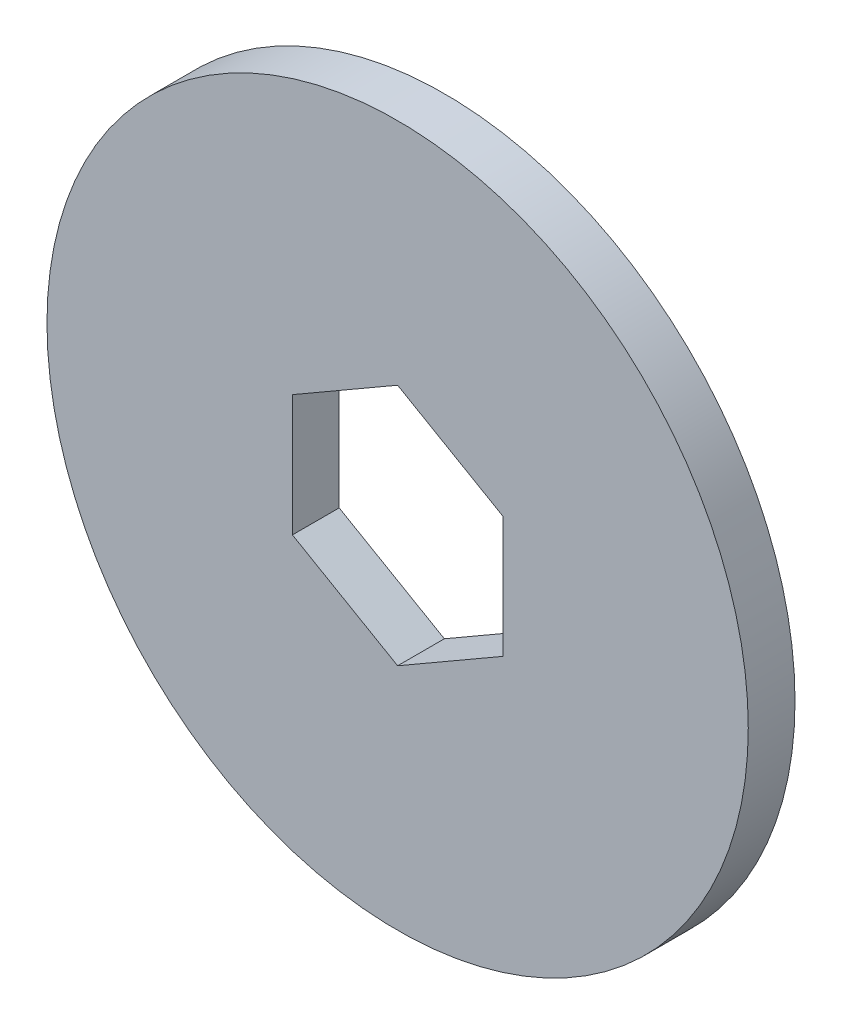
ISO-10303-21;
HEADER;
FILE_DESCRIPTION(('STEP AP214'),'2;1');
FILE_NAME('part.step','',(''),(''),'','','');
FILE_SCHEMA(('AUTOMOTIVE_DESIGN { 1 0 10303 214 1 1 1 1 }'));
ENDSEC;
DATA;
#1=APPLICATION_CONTEXT('core data for automotive mechanical design processes');
#2=APPLICATION_PROTOCOL_DEFINITION('international standard','automotive_design',2000,#1);
#3=PRODUCT_CONTEXT('',#1,'mechanical');
#4=PRODUCT('Part','Part','',(#3));
#5=PRODUCT_RELATED_PRODUCT_CATEGORY('part','',(#4));
#6=PRODUCT_DEFINITION_FORMATION('','',#4);
#7=PRODUCT_DEFINITION_CONTEXT('part definition',#1,'design');
#8=PRODUCT_DEFINITION('design','',#6,#7);
#9=PRODUCT_DEFINITION_SHAPE('','',#8);
#10=(LENGTH_UNIT() NAMED_UNIT(*) SI_UNIT(.MILLI.,.METRE.));
#11=(NAMED_UNIT(*) PLANE_ANGLE_UNIT() SI_UNIT($,.RADIAN.));
#12=(NAMED_UNIT(*) SI_UNIT($,.STERADIAN.) SOLID_ANGLE_UNIT());
#13=UNCERTAINTY_MEASURE_WITH_UNIT(LENGTH_MEASURE(1.E-05),#10,'distance_accuracy_value','');
#14=(GEOMETRIC_REPRESENTATION_CONTEXT(3) GLOBAL_UNCERTAINTY_ASSIGNED_CONTEXT((#13)) GLOBAL_UNIT_ASSIGNED_CONTEXT((#10,
#11,#12)) REPRESENTATION_CONTEXT('',''));
#15=CARTESIAN_POINT('',(0.,0.,0.));
#16=DIRECTION('',(0.,0.,1.));
#17=DIRECTION('',(1.,0.,0.));
#18=AXIS2_PLACEMENT_3D('',#15,#16,#17);
#19=CARTESIAN_POINT('',(642.300000000008,-191.99999999999,6.));
#20=DIRECTION('',(0.,0.,1.));
#21=DIRECTION('',(1.,0.,0.));
#22=AXIS2_PLACEMENT_3D('',#19,#20,#21);
#23=PLANE('',#22);
#24=DIRECTION('',(0.,-1.,0.));
#25=VECTOR('',#24,1.);
#26=CARTESIAN_POINT('',(628.800000000008,-184.20577136589,6.));
#27=LINE('',#26,#25);
#28=CARTESIAN_POINT('',(628.800000000008,-184.20577136589,6.));
#29=VERTEX_POINT('',#28);
#30=CARTESIAN_POINT('',(628.800000000008,-199.79422863409,6.));
#31=VERTEX_POINT('',#30);
#32=EDGE_CURVE('E94',#29,#31,#27,.T.);
#33=ORIENTED_EDGE('',*,*,#32,.F.);
#34=DIRECTION('',(-0.866025403786105,-0.499999999997114,0.));
#35=VECTOR('',#34,1.);
#36=CARTESIAN_POINT('',(642.300000000008,-176.41154273189,6.));
#37=LINE('',#36,#35);
#38=CARTESIAN_POINT('',(642.300000000008,-176.41154273189,6.));
#39=VERTEX_POINT('',#38);
#40=EDGE_CURVE('E87',#39,#29,#37,.T.);
#41=ORIENTED_EDGE('',*,*,#40,.F.);
#42=DIRECTION('',(-0.8660254037845,0.499999999999893,0.));
#43=VECTOR('',#42,1.);
#44=CARTESIAN_POINT('',(655.799999999908,-184.20577136589,6.));
#45=LINE('',#44,#43);
#46=CARTESIAN_POINT('',(655.799999999908,-184.20577136589,6.));
#47=VERTEX_POINT('',#46);
#48=EDGE_CURVE('E114',#47,#39,#45,.T.);
#49=ORIENTED_EDGE('',*,*,#48,.F.);
#50=DIRECTION('',(0.,1.,0.));
#51=VECTOR('',#50,1.);
#52=CARTESIAN_POINT('',(655.799999999908,-199.79422863409,6.));
#53=LINE('',#52,#51);
#54=CARTESIAN_POINT('',(655.799999999908,-199.79422863409,6.));
#55=VERTEX_POINT('',#54);
#56=EDGE_CURVE('E112',#55,#47,#53,.T.);
#57=ORIENTED_EDGE('',*,*,#56,.F.);
#58=DIRECTION('',(0.8660254037845,0.499999999999893,0.));
#59=VECTOR('',#58,1.);
#60=CARTESIAN_POINT('',(642.300000000008,-207.58845726809,6.));
#61=LINE('',#60,#59);
#62=CARTESIAN_POINT('',(642.300000000008,-207.58845726809,6.));
#63=VERTEX_POINT('',#62);
#64=EDGE_CURVE('E107',#63,#55,#61,.T.);
#65=ORIENTED_EDGE('',*,*,#64,.F.);
#66=DIRECTION('',(0.866025403786105,-0.499999999997114,0.));
#67=VECTOR('',#66,1.);
#68=CARTESIAN_POINT('',(628.800000000008,-199.79422863409,6.));
#69=LINE('',#68,#67);
#70=EDGE_CURVE('E105',#31,#63,#69,.T.);
#71=ORIENTED_EDGE('',*,*,#70,.F.);
#72=EDGE_LOOP('',(#33,#41,#49,#57,#65,#71));
#73=FACE_BOUND('',#72,.T.);
#74=CARTESIAN_POINT('',(642.300000000008,-191.99999999999,6.));
#75=DIRECTION('',(0.,0.,1.));
#76=DIRECTION('',(1.,0.,0.));
#77=AXIS2_PLACEMENT_3D('',#74,#75,#76);
#78=CIRCLE('',#77,45.0000000000001);
#79=CARTESIAN_POINT('',(687.300000000008,-191.99999999999,6.));
#80=VERTEX_POINT('',#79);
#81=EDGE_CURVE('E223',#80,#80,#78,.T.);
#82=ORIENTED_EDGE('',*,*,#81,.T.);
#83=EDGE_LOOP('',(#82));
#84=FACE_BOUND('',#83,.T.);
#85=ADVANCED_FACE('F35',(#73,#84),#23,.T.);
#86=CARTESIAN_POINT('',(642.300000000008,-191.99999999999,0.));
#87=DIRECTION('',(0.,0.,1.));
#88=DIRECTION('',(1.,0.,0.));
#89=AXIS2_PLACEMENT_3D('',#86,#87,#88);
#90=PLANE('',#89);
#91=DIRECTION('',(-0.866025403786105,-0.499999999997114,0.));
#92=VECTOR('',#91,1.);
#93=CARTESIAN_POINT('',(642.300000000008,-176.41154273189,0.));
#94=LINE('',#93,#92);
#95=CARTESIAN_POINT('',(642.300000000008,-176.41154273189,0.));
#96=VERTEX_POINT('',#95);
#97=CARTESIAN_POINT('',(628.800000000008,-184.20577136589,0.));
#98=VERTEX_POINT('',#97);
#99=EDGE_CURVE('E57',#96,#98,#94,.T.);
#100=ORIENTED_EDGE('',*,*,#99,.T.);
#101=DIRECTION('',(0.,-1.,0.));
#102=VECTOR('',#101,1.);
#103=CARTESIAN_POINT('',(628.800000000008,-184.20577136589,0.));
#104=LINE('',#103,#102);
#105=CARTESIAN_POINT('',(628.800000000008,-199.79422863409,0.));
#106=VERTEX_POINT('',#105);
#107=EDGE_CURVE('E101',#98,#106,#104,.T.);
#108=ORIENTED_EDGE('',*,*,#107,.T.);
#109=DIRECTION('',(0.866025403786105,-0.499999999997114,0.));
#110=VECTOR('',#109,1.);
#111=CARTESIAN_POINT('',(628.800000000008,-199.79422863409,0.));
#112=LINE('',#111,#110);
#113=CARTESIAN_POINT('',(642.300000000008,-207.58845726809,0.));
#114=VERTEX_POINT('',#113);
#115=EDGE_CURVE('E119',#106,#114,#112,.T.);
#116=ORIENTED_EDGE('',*,*,#115,.T.);
#117=DIRECTION('',(0.8660254037845,0.499999999999893,0.));
#118=VECTOR('',#117,1.);
#119=CARTESIAN_POINT('',(642.300000000008,-207.58845726809,0.));
#120=LINE('',#119,#118);
#121=CARTESIAN_POINT('',(655.799999999908,-199.79422863409,0.));
#122=VERTEX_POINT('',#121);
#123=EDGE_CURVE('E122',#114,#122,#120,.T.);
#124=ORIENTED_EDGE('',*,*,#123,.T.);
#125=DIRECTION('',(0.,1.,0.));
#126=VECTOR('',#125,1.);
#127=CARTESIAN_POINT('',(655.799999999908,-199.79422863409,0.));
#128=LINE('',#127,#126);
#129=CARTESIAN_POINT('',(655.799999999908,-184.20577136589,0.));
#130=VERTEX_POINT('',#129);
#131=EDGE_CURVE('E125',#122,#130,#128,.T.);
#132=ORIENTED_EDGE('',*,*,#131,.T.);
#133=DIRECTION('',(-0.8660254037845,0.499999999999893,0.));
#134=VECTOR('',#133,1.);
#135=CARTESIAN_POINT('',(655.799999999908,-184.20577136589,0.));
#136=LINE('',#135,#134);
#137=EDGE_CURVE('E95',#130,#96,#136,.T.);
#138=ORIENTED_EDGE('',*,*,#137,.T.);
#139=EDGE_LOOP('',(#100,#108,#116,#124,#132,#138));
#140=FACE_BOUND('',#139,.T.);
#141=CARTESIAN_POINT('',(642.300000000008,-191.99999999999,0.));
#142=DIRECTION('',(0.,0.,1.));
#143=DIRECTION('',(1.,0.,0.));
#144=AXIS2_PLACEMENT_3D('',#141,#142,#143);
#145=CIRCLE('',#144,45.0000000000001);
#146=CARTESIAN_POINT('',(687.300000000008,-191.99999999999,0.));
#147=VERTEX_POINT('',#146);
#148=EDGE_CURVE('E117',#147,#147,#145,.T.);
#149=ORIENTED_EDGE('',*,*,#148,.F.);
#150=EDGE_LOOP('',(#149));
#151=FACE_BOUND('',#150,.T.);
#152=ADVANCED_FACE('F37',(#140,#151),#90,.F.);
#153=CARTESIAN_POINT('',(642.300000000008,-176.41154273189,6.));
#154=DIRECTION('',(0.499999999997114,-0.866025403786105,0.));
#155=DIRECTION('',(0.866025403786105,0.499999999997114,0.));
#156=AXIS2_PLACEMENT_3D('',#153,#154,#155);
#157=PLANE('',#156);
#158=ORIENTED_EDGE('',*,*,#99,.F.);
#159=DIRECTION('',(0.,0.,-1.));
#160=VECTOR('',#159,1.);
#161=CARTESIAN_POINT('',(642.300000000008,-176.41154273189,6.));
#162=LINE('',#161,#160);
#163=EDGE_CURVE('E90',#39,#96,#162,.T.);
#164=ORIENTED_EDGE('',*,*,#163,.F.);
#165=ORIENTED_EDGE('',*,*,#40,.T.);
#166=DIRECTION('',(0.,0.,-1.));
#167=VECTOR('',#166,1.);
#168=CARTESIAN_POINT('',(628.800000000008,-184.20577136589,6.));
#169=LINE('',#168,#167);
#170=EDGE_CURVE('E11',#29,#98,#169,.T.);
#171=ORIENTED_EDGE('',*,*,#170,.T.);
#172=EDGE_LOOP('',(#158,#164,#165,#171));
#173=FACE_BOUND('',#172,.T.);
#174=ADVANCED_FACE('F89',(#173),#157,.T.);
#175=CARTESIAN_POINT('',(628.800000000008,-184.20577136589,6.));
#176=DIRECTION('',(1.,0.,0.));
#177=DIRECTION('',(0.,0.,-1.));
#178=AXIS2_PLACEMENT_3D('',#175,#176,#177);
#179=PLANE('',#178);
#180=ORIENTED_EDGE('',*,*,#107,.F.);
#181=ORIENTED_EDGE('',*,*,#170,.F.);
#182=ORIENTED_EDGE('',*,*,#32,.T.);
#183=DIRECTION('',(0.,0.,-1.));
#184=VECTOR('',#183,1.);
#185=CARTESIAN_POINT('',(628.800000000008,-199.79422863409,6.));
#186=LINE('',#185,#184);
#187=EDGE_CURVE('E43',#31,#106,#186,.T.);
#188=ORIENTED_EDGE('',*,*,#187,.T.);
#189=EDGE_LOOP('',(#180,#181,#182,#188));
#190=FACE_BOUND('',#189,.T.);
#191=ADVANCED_FACE('F98',(#190),#179,.T.);
#192=CARTESIAN_POINT('',(628.800000000008,-199.79422863409,6.));
#193=DIRECTION('',(0.499999999997114,0.866025403786105,0.));
#194=DIRECTION('',(-0.866025403786105,0.499999999997114,0.));
#195=AXIS2_PLACEMENT_3D('',#192,#193,#194);
#196=PLANE('',#195);
#197=ORIENTED_EDGE('',*,*,#115,.F.);
#198=ORIENTED_EDGE('',*,*,#187,.F.);
#199=ORIENTED_EDGE('',*,*,#70,.T.);
#200=DIRECTION('',(0.,0.,-1.));
#201=VECTOR('',#200,1.);
#202=CARTESIAN_POINT('',(642.300000000008,-207.58845726809,6.));
#203=LINE('',#202,#201);
#204=EDGE_CURVE('E134',#63,#114,#203,.T.);
#205=ORIENTED_EDGE('',*,*,#204,.T.);
#206=EDGE_LOOP('',(#197,#198,#199,#205));
#207=FACE_BOUND('',#206,.T.);
#208=ADVANCED_FACE('F137',(#207),#196,.T.);
#209=CARTESIAN_POINT('',(642.300000000008,-207.58845726809,6.));
#210=DIRECTION('',(-0.499999999999893,0.866025403784501,0.));
#211=DIRECTION('',(-0.866025403784501,-0.499999999999893,0.));
#212=AXIS2_PLACEMENT_3D('',#209,#210,#211);
#213=PLANE('',#212);
#214=ORIENTED_EDGE('',*,*,#123,.F.);
#215=ORIENTED_EDGE('',*,*,#204,.F.);
#216=ORIENTED_EDGE('',*,*,#64,.T.);
#217=DIRECTION('',(0.,0.,-1.));
#218=VECTOR('',#217,1.);
#219=CARTESIAN_POINT('',(655.799999999908,-199.79422863409,6.));
#220=LINE('',#219,#218);
#221=EDGE_CURVE('E132',#55,#122,#220,.T.);
#222=ORIENTED_EDGE('',*,*,#221,.T.);
#223=EDGE_LOOP('',(#214,#215,#216,#222));
#224=FACE_BOUND('',#223,.T.);
#225=ADVANCED_FACE('F149',(#224),#213,.T.);
#226=CARTESIAN_POINT('',(655.799999999908,-199.79422863409,6.));
#227=DIRECTION('',(-1.,0.,0.));
#228=DIRECTION('',(0.,0.,1.));
#229=AXIS2_PLACEMENT_3D('',#226,#227,#228);
#230=PLANE('',#229);
#231=ORIENTED_EDGE('',*,*,#131,.F.);
#232=ORIENTED_EDGE('',*,*,#221,.F.);
#233=ORIENTED_EDGE('',*,*,#56,.T.);
#234=DIRECTION('',(0.,0.,-1.));
#235=VECTOR('',#234,1.);
#236=CARTESIAN_POINT('',(655.799999999908,-184.20577136589,6.));
#237=LINE('',#236,#235);
#238=EDGE_CURVE('E50',#47,#130,#237,.T.);
#239=ORIENTED_EDGE('',*,*,#238,.T.);
#240=EDGE_LOOP('',(#231,#232,#233,#239));
#241=FACE_BOUND('',#240,.T.);
#242=ADVANCED_FACE('F147',(#241),#230,.T.);
#243=CARTESIAN_POINT('',(655.799999999908,-184.20577136589,6.));
#244=DIRECTION('',(-0.499999999999893,-0.866025403784501,0.));
#245=DIRECTION('',(0.866025403784501,-0.499999999999893,0.));
#246=AXIS2_PLACEMENT_3D('',#243,#244,#245);
#247=PLANE('',#246);
#248=ORIENTED_EDGE('',*,*,#137,.F.);
#249=ORIENTED_EDGE('',*,*,#238,.F.);
#250=ORIENTED_EDGE('',*,*,#48,.T.);
#251=ORIENTED_EDGE('',*,*,#163,.T.);
#252=EDGE_LOOP('',(#248,#249,#250,#251));
#253=FACE_BOUND('',#252,.T.);
#254=ADVANCED_FACE('F143',(#253),#247,.T.);
#255=CARTESIAN_POINT('',(642.300000000008,-191.99999999999,0.));
#256=DIRECTION('',(0.,0.,1.));
#257=DIRECTION('',(1.,0.,0.));
#258=AXIS2_PLACEMENT_3D('',#255,#256,#257);
#259=CYLINDRICAL_SURFACE('',#258,45.0000000000001);
#260=ORIENTED_EDGE('',*,*,#148,.T.);
#261=EDGE_LOOP('',(#260));
#262=FACE_BOUND('',#261,.T.);
#263=ORIENTED_EDGE('',*,*,#81,.F.);
#264=EDGE_LOOP('',(#263));
#265=FACE_BOUND('',#264,.T.);
#266=ADVANCED_FACE('F192',(#262,#265),#259,.T.);
#267=CLOSED_SHELL('',(#85,#152,#174,#191,#208,#225,#242,#254,#266));
#268=MANIFOLD_SOLID_BREP('B2',#267);
#269=ADVANCED_BREP_SHAPE_REPRESENTATION('',(#18,#268),#14);
#270=SHAPE_DEFINITION_REPRESENTATION(#9,#269);
ENDSEC;
END-ISO-10303-21;
